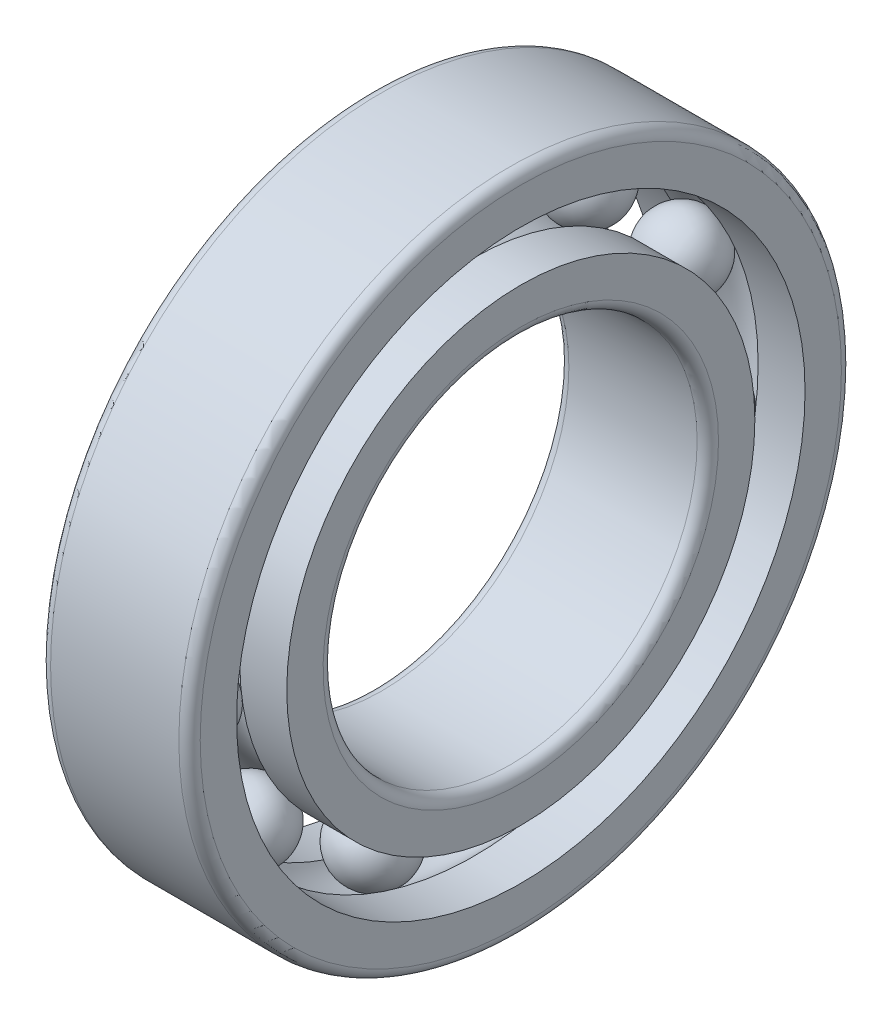
ISO-10303-21;
HEADER;
FILE_DESCRIPTION(('STEP AP214'),'2;1');
FILE_NAME('part.step','',(''),(''),'','','');
FILE_SCHEMA(('AUTOMOTIVE_DESIGN { 1 0 10303 214 1 1 1 1 }'));
ENDSEC;
DATA;
#1=APPLICATION_CONTEXT('core data for automotive mechanical design processes');
#2=APPLICATION_PROTOCOL_DEFINITION('international standard','automotive_design',2000,#1);
#3=PRODUCT_CONTEXT('',#1,'mechanical');
#4=PRODUCT('Part','Part','',(#3));
#5=PRODUCT_RELATED_PRODUCT_CATEGORY('part','',(#4));
#6=PRODUCT_DEFINITION_FORMATION('','',#4);
#7=PRODUCT_DEFINITION_CONTEXT('part definition',#1,'design');
#8=PRODUCT_DEFINITION('design','',#6,#7);
#9=PRODUCT_DEFINITION_SHAPE('','',#8);
#10=(LENGTH_UNIT() NAMED_UNIT(*) SI_UNIT(.MILLI.,.METRE.));
#11=(NAMED_UNIT(*) PLANE_ANGLE_UNIT() SI_UNIT($,.RADIAN.));
#12=(NAMED_UNIT(*) SI_UNIT($,.STERADIAN.) SOLID_ANGLE_UNIT());
#13=UNCERTAINTY_MEASURE_WITH_UNIT(LENGTH_MEASURE(1.E-05),#10,'distance_accuracy_value','');
#14=(GEOMETRIC_REPRESENTATION_CONTEXT(3) GLOBAL_UNCERTAINTY_ASSIGNED_CONTEXT((#13)) GLOBAL_UNIT_ASSIGNED_CONTEXT((#10,
#11,#12)) REPRESENTATION_CONTEXT('',''));
#15=CARTESIAN_POINT('',(0.,0.,0.));
#16=DIRECTION('',(0.,0.,1.));
#17=DIRECTION('',(1.,0.,0.));
#18=AXIS2_PLACEMENT_3D('',#15,#16,#17);
#19=CARTESIAN_POINT('',(7.,-15.8803727981732,18.3269271780908));
#20=DIRECTION('',(1.,0.,0.));
#21=DIRECTION('',(0.,-0.654860733945285,0.755749574354258));
#22=AXIS2_PLACEMENT_3D('',#19,#20,#21);
#23=SPHERICAL_SURFACE('',#22,3.51);
#24=CARTESIAN_POINT('',(3.49,-15.8803727981732,18.3269271780908));
#25=VERTEX_POINT('',#24);
#26=VERTEX_LOOP('',#25);
#27=FACE_BOUND('',#26,.T.);
#28=CARTESIAN_POINT('',(10.51,-15.8803727981732,18.3269271780908));
#29=VERTEX_POINT('',#28);
#30=VERTEX_LOOP('',#29);
#31=FACE_BOUND('',#30,.T.);
#32=ADVANCED_FACE('P0_F15',(#27,#31),#23,.T.);
#33=OPEN_SHELL('',(#32));
#34=SHELL_BASED_SURFACE_MODEL('P0_B1',(#33));
#35=CARTESIAN_POINT('',(7.,10.0738140652957,22.0585758873471));
#36=DIRECTION('',(1.,0.,0.));
#37=DIRECTION('',(0.,0.415415013001886,0.909631995354519));
#38=AXIS2_PLACEMENT_3D('',#35,#36,#37);
#39=SPHERICAL_SURFACE('',#38,3.51);
#40=CARTESIAN_POINT('',(3.49,10.0738140652957,22.0585758873471));
#41=VERTEX_POINT('',#40);
#42=VERTEX_LOOP('',#41);
#43=FACE_BOUND('',#42,.T.);
#44=CARTESIAN_POINT('',(10.51,10.0738140652957,22.0585758873471));
#45=VERTEX_POINT('',#44);
#46=VERTEX_LOOP('',#45);
#47=FACE_BOUND('',#46,.T.);
#48=ADVANCED_FACE('P1_F15',(#43,#47),#39,.T.);
#49=OPEN_SHELL('',(#48));
#50=SHELL_BASED_SURFACE_MODEL('P1_B1',(#49));
#51=CARTESIAN_POINT('',(7.,-23.2677046101516,-6.83201450340466));
#52=DIRECTION('',(1.,0.,0.));
#53=DIRECTION('',(0.,-0.959492973614498,-0.281732556841429));
#54=AXIS2_PLACEMENT_3D('',#51,#52,#53);
#55=SPHERICAL_SURFACE('',#54,3.51);
#56=CARTESIAN_POINT('',(3.49,-23.2677046101516,-6.83201450340466));
#57=VERTEX_POINT('',#56);
#58=VERTEX_LOOP('',#57);
#59=FACE_BOUND('',#58,.T.);
#60=CARTESIAN_POINT('',(10.51,-23.2677046101516,-6.83201450340466));
#61=VERTEX_POINT('',#60);
#62=VERTEX_LOOP('',#61);
#63=FACE_BOUND('',#62,.T.);
#64=ADVANCED_FACE('P2_F16',(#59,#63),#55,.T.);
#65=OPEN_SHELL('',(#64));
#66=SHELL_BASED_SURFACE_MODEL('P2_B1',(#65));
#67=CARTESIAN_POINT('',(7.,20.4003981711561,-13.1105398232982));
#68=DIRECTION('',(1.,0.,0.));
#69=DIRECTION('',(0.,0.841253532831181,-0.540640817455598));
#70=AXIS2_PLACEMENT_3D('',#67,#68,#69);
#71=SPHERICAL_SURFACE('',#70,3.51);
#72=CARTESIAN_POINT('',(3.49,20.4003981711561,-13.1105398232982));
#73=VERTEX_POINT('',#72);
#74=VERTEX_LOOP('',#73);
#75=FACE_BOUND('',#74,.T.);
#76=CARTESIAN_POINT('',(10.51,20.4003981711561,-13.1105398232982));
#77=VERTEX_POINT('',#76);
#78=VERTEX_LOOP('',#77);
#79=FACE_BOUND('',#78,.T.);
#80=ADVANCED_FACE('P3_F15',(#75,#79),#71,.T.);
#81=OPEN_SHELL('',(#80));
#82=SHELL_BASED_SURFACE_MODEL('P3_B1',(#81));
#83=CARTESIAN_POINT('',(7.,-3.45113482812716,-24.0031699656126));
#84=DIRECTION('',(1.,0.,0.));
#85=DIRECTION('',(0.,-0.142314838273285,-0.989821441880933));
#86=AXIS2_PLACEMENT_3D('',#83,#84,#85);
#87=SPHERICAL_SURFACE('',#86,3.51);
#88=CARTESIAN_POINT('',(3.49,-3.45113482812716,-24.0031699656126));
#89=VERTEX_POINT('',#88);
#90=VERTEX_LOOP('',#89);
#91=FACE_BOUND('',#90,.T.);
#92=CARTESIAN_POINT('',(10.51,-3.45113482812716,-24.0031699656126));
#93=VERTEX_POINT('',#92);
#94=VERTEX_LOOP('',#93);
#95=FACE_BOUND('',#94,.T.);
#96=ADVANCED_FACE('P4_F15',(#91,#95),#87,.T.);
#97=OPEN_SHELL('',(#96));
#98=SHELL_BASED_SURFACE_MODEL('P4_B1',(#97));
#99=CARTESIAN_POINT('',(7.,24.25,0.));
#100=DIRECTION('',(1.,0.,0.));
#101=DIRECTION('',(0.,1.,0.));
#102=AXIS2_PLACEMENT_3D('',#99,#100,#101);
#103=SPHERICAL_SURFACE('',#102,3.51);
#104=CARTESIAN_POINT('',(3.49,24.25,0.));
#105=VERTEX_POINT('',#104);
#106=VERTEX_LOOP('',#105);
#107=FACE_BOUND('',#106,.T.);
#108=CARTESIAN_POINT('',(10.51,24.25,0.));
#109=VERTEX_POINT('',#108);
#110=VERTEX_LOOP('',#109);
#111=FACE_BOUND('',#110,.T.);
#112=ADVANCED_FACE('P5_F15',(#107,#111),#103,.T.);
#113=OPEN_SHELL('',(#112));
#114=SHELL_BASED_SURFACE_MODEL('P5_B1',(#113));
#115=CARTESIAN_POINT('',(7.,20.4003981711561,13.1105398232982));
#116=DIRECTION('',(1.,0.,0.));
#117=DIRECTION('',(0.,0.841253532831181,0.540640817455598));
#118=AXIS2_PLACEMENT_3D('',#115,#116,#117);
#119=SPHERICAL_SURFACE('',#118,3.51);
#120=CARTESIAN_POINT('',(3.49,20.4003981711561,13.1105398232982));
#121=VERTEX_POINT('',#120);
#122=VERTEX_LOOP('',#121);
#123=FACE_BOUND('',#122,.T.);
#124=CARTESIAN_POINT('',(10.51,20.4003981711561,13.1105398232982));
#125=VERTEX_POINT('',#124);
#126=VERTEX_LOOP('',#125);
#127=FACE_BOUND('',#126,.T.);
#128=ADVANCED_FACE('P6_F15',(#123,#127),#119,.T.);
#129=OPEN_SHELL('',(#128));
#130=SHELL_BASED_SURFACE_MODEL('P6_B1',(#129));
#131=CARTESIAN_POINT('',(7.,-3.45113482812716,24.0031699656126));
#132=DIRECTION('',(1.,0.,0.));
#133=DIRECTION('',(0.,-0.142314838273285,0.989821441880933));
#134=AXIS2_PLACEMENT_3D('',#131,#132,#133);
#135=SPHERICAL_SURFACE('',#134,3.51);
#136=CARTESIAN_POINT('',(3.49,-3.45113482812716,24.0031699656126));
#137=VERTEX_POINT('',#136);
#138=VERTEX_LOOP('',#137);
#139=FACE_BOUND('',#138,.T.);
#140=CARTESIAN_POINT('',(10.51,-3.45113482812716,24.0031699656126));
#141=VERTEX_POINT('',#140);
#142=VERTEX_LOOP('',#141);
#143=FACE_BOUND('',#142,.T.);
#144=ADVANCED_FACE('P7_F15',(#139,#143),#135,.T.);
#145=OPEN_SHELL('',(#144));
#146=SHELL_BASED_SURFACE_MODEL('P7_B1',(#145));
#147=CARTESIAN_POINT('',(7.,10.0738140652957,-22.0585758873471));
#148=DIRECTION('',(1.,0.,0.));
#149=DIRECTION('',(0.,0.415415013001886,-0.909631995354519));
#150=AXIS2_PLACEMENT_3D('',#147,#148,#149);
#151=SPHERICAL_SURFACE('',#150,3.51);
#152=CARTESIAN_POINT('',(3.49,10.0738140652957,-22.0585758873471));
#153=VERTEX_POINT('',#152);
#154=VERTEX_LOOP('',#153);
#155=FACE_BOUND('',#154,.T.);
#156=CARTESIAN_POINT('',(10.51,10.0738140652957,-22.0585758873471));
#157=VERTEX_POINT('',#156);
#158=VERTEX_LOOP('',#157);
#159=FACE_BOUND('',#158,.T.);
#160=ADVANCED_FACE('P8_F15',(#155,#159),#151,.T.);
#161=OPEN_SHELL('',(#160));
#162=SHELL_BASED_SURFACE_MODEL('P8_B1',(#161));
#163=CARTESIAN_POINT('',(7.,-23.2677046101516,6.83201450340467));
#164=DIRECTION('',(1.,0.,0.));
#165=DIRECTION('',(0.,-0.959492973614497,0.28173255684143));
#166=AXIS2_PLACEMENT_3D('',#163,#164,#165);
#167=SPHERICAL_SURFACE('',#166,3.51);
#168=CARTESIAN_POINT('',(3.49,-23.2677046101516,6.83201450340467));
#169=VERTEX_POINT('',#168);
#170=VERTEX_LOOP('',#169);
#171=FACE_BOUND('',#170,.T.);
#172=CARTESIAN_POINT('',(10.51,-23.2677046101516,6.83201450340467));
#173=VERTEX_POINT('',#172);
#174=VERTEX_LOOP('',#173);
#175=FACE_BOUND('',#174,.T.);
#176=ADVANCED_FACE('P9_F15',(#171,#175),#167,.T.);
#177=OPEN_SHELL('',(#176));
#178=SHELL_BASED_SURFACE_MODEL('P9_B1',(#177));
#179=CARTESIAN_POINT('',(7.,-15.8803727981732,-18.3269271780908));
#180=DIRECTION('',(1.,0.,0.));
#181=DIRECTION('',(0.,-0.654860733945285,-0.755749574354258));
#182=AXIS2_PLACEMENT_3D('',#179,#180,#181);
#183=SPHERICAL_SURFACE('',#182,3.51);
#184=CARTESIAN_POINT('',(3.49,-15.8803727981732,-18.3269271780908));
#185=VERTEX_POINT('',#184);
#186=VERTEX_LOOP('',#185);
#187=FACE_BOUND('',#186,.T.);
#188=CARTESIAN_POINT('',(10.51,-15.8803727981732,-18.3269271780908));
#189=VERTEX_POINT('',#188);
#190=VERTEX_LOOP('',#189);
#191=FACE_BOUND('',#190,.T.);
#192=ADVANCED_FACE('P10_F15',(#187,#191),#183,.T.);
#193=OPEN_SHELL('',(#192));
#194=SHELL_BASED_SURFACE_MODEL('P10_B1',(#193));
#195=CARTESIAN_POINT('',(7.,0.,0.));
#196=DIRECTION('',(1.,0.,0.));
#197=DIRECTION('',(0.,0.,-1.));
#198=AXIS2_PLACEMENT_3D('',#195,#196,#197);
#199=TOROIDAL_SURFACE('',#198,24.25,3.51);
#200=CARTESIAN_POINT('',(9.60812173795626,0.,0.));
#201=DIRECTION('',(1.,0.,0.));
#202=DIRECTION('',(0.,0.,-1.));
#203=AXIS2_PLACEMENT_3D('',#200,#201,#202);
#204=CIRCLE('',#203,21.901);
#205=CARTESIAN_POINT('',(9.60812173795626,0.,-21.901));
#206=VERTEX_POINT('',#205);
#207=EDGE_CURVE('P11_E112',#206,#206,#204,.T.);
#208=ORIENTED_EDGE('',*,*,#207,.F.);
#209=EDGE_LOOP('',(#208));
#210=FACE_BOUND('',#209,.T.);
#211=CARTESIAN_POINT('',(4.39187826204374,0.,0.));
#212=DIRECTION('',(1.,0.,0.));
#213=DIRECTION('',(0.,0.,-1.));
#214=AXIS2_PLACEMENT_3D('',#211,#212,#213);
#215=CIRCLE('',#214,21.901);
#216=CARTESIAN_POINT('',(4.39187826204374,0.,-21.901));
#217=VERTEX_POINT('',#216);
#218=EDGE_CURVE('P11_E115',#217,#217,#215,.F.);
#219=ORIENTED_EDGE('',*,*,#218,.F.);
#220=EDGE_LOOP('',(#219));
#221=FACE_BOUND('',#220,.T.);
#222=ADVANCED_FACE('P11_F14',(#210,#221),#199,.F.);
#223=CARTESIAN_POINT('',(2.19593913102187,0.,0.));
#224=DIRECTION('',(1.,0.,0.));
#225=DIRECTION('',(0.,0.,-1.));
#226=AXIS2_PLACEMENT_3D('',#223,#224,#225);
#227=CYLINDRICAL_SURFACE('',#226,21.901);
#228=CARTESIAN_POINT('',(0.,0.,0.));
#229=DIRECTION('',(1.,0.,0.));
#230=DIRECTION('',(0.,0.,-1.));
#231=AXIS2_PLACEMENT_3D('',#228,#229,#230);
#232=CIRCLE('',#231,21.901);
#233=CARTESIAN_POINT('',(0.,0.,-21.901));
#234=VERTEX_POINT('',#233);
#235=EDGE_CURVE('P11_E18',#234,#234,#232,.F.);
#236=ORIENTED_EDGE('',*,*,#235,.F.);
#237=EDGE_LOOP('',(#236));
#238=FACE_BOUND('',#237,.T.);
#239=ORIENTED_EDGE('',*,*,#218,.T.);
#240=EDGE_LOOP('',(#239));
#241=FACE_BOUND('',#240,.T.);
#242=ADVANCED_FACE('P11_F83',(#238,#241),#227,.T.);
#243=CARTESIAN_POINT('',(11.8040608689781,0.,0.));
#244=DIRECTION('',(1.,0.,0.));
#245=DIRECTION('',(0.,0.,-1.));
#246=AXIS2_PLACEMENT_3D('',#243,#244,#245);
#247=CYLINDRICAL_SURFACE('',#246,21.901);
#248=ORIENTED_EDGE('',*,*,#207,.T.);
#249=EDGE_LOOP('',(#248));
#250=FACE_BOUND('',#249,.T.);
#251=CARTESIAN_POINT('',(14.,0.,0.));
#252=DIRECTION('',(1.,0.,0.));
#253=DIRECTION('',(0.,0.,-1.));
#254=AXIS2_PLACEMENT_3D('',#251,#252,#253);
#255=CIRCLE('',#254,21.901);
#256=CARTESIAN_POINT('',(14.,0.,-21.901));
#257=VERTEX_POINT('',#256);
#258=EDGE_CURVE('P11_E107',#257,#257,#255,.T.);
#259=ORIENTED_EDGE('',*,*,#258,.F.);
#260=EDGE_LOOP('',(#259));
#261=FACE_BOUND('',#260,.T.);
#262=ADVANCED_FACE('P11_F80',(#250,#261),#247,.T.);
#263=CARTESIAN_POINT('',(0.,19.7005,0.));
#264=DIRECTION('',(-1.,0.,0.));
#265=DIRECTION('',(0.,0.,1.));
#266=AXIS2_PLACEMENT_3D('',#263,#264,#265);
#267=PLANE('',#266);
#268=CARTESIAN_POINT('',(0.,0.,0.));
#269=DIRECTION('',(-1.,0.,0.));
#270=DIRECTION('',(0.,1.,0.));
#271=AXIS2_PLACEMENT_3D('',#268,#269,#270);
#272=CIRCLE('',#271,18.5);
#273=CARTESIAN_POINT('',(0.,18.5,0.));
#274=VERTEX_POINT('',#273);
#275=EDGE_CURVE('P11_E64',#274,#274,#272,.T.);
#276=ORIENTED_EDGE('',*,*,#275,.F.);
#277=EDGE_LOOP('',(#276));
#278=FACE_BOUND('',#277,.T.);
#279=ORIENTED_EDGE('',*,*,#235,.T.);
#280=EDGE_LOOP('',(#279));
#281=FACE_BOUND('',#280,.T.);
#282=ADVANCED_FACE('P11_F70',(#278,#281),#267,.T.);
#283=CARTESIAN_POINT('',(14.,19.7005,0.));
#284=DIRECTION('',(1.,0.,0.));
#285=DIRECTION('',(0.,0.,-1.));
#286=AXIS2_PLACEMENT_3D('',#283,#284,#285);
#287=PLANE('',#286);
#288=CARTESIAN_POINT('',(14.,0.,0.));
#289=DIRECTION('',(1.,0.,0.));
#290=DIRECTION('',(0.,1.,0.));
#291=AXIS2_PLACEMENT_3D('',#288,#289,#290);
#292=CIRCLE('',#291,18.5);
#293=CARTESIAN_POINT('',(14.,18.5,0.));
#294=VERTEX_POINT('',#293);
#295=EDGE_CURVE('P11_E27',#294,#294,#292,.T.);
#296=ORIENTED_EDGE('',*,*,#295,.F.);
#297=EDGE_LOOP('',(#296));
#298=FACE_BOUND('',#297,.T.);
#299=ORIENTED_EDGE('',*,*,#258,.T.);
#300=EDGE_LOOP('',(#299));
#301=FACE_BOUND('',#300,.T.);
#302=ADVANCED_FACE('P11_F79',(#298,#301),#287,.T.);
#303=CARTESIAN_POINT('',(0.999999999999996,0.,0.));
#304=DIRECTION('',(1.,0.,0.));
#305=DIRECTION('',(0.,0.,-1.));
#306=AXIS2_PLACEMENT_3D('',#303,#304,#305);
#307=TOROIDAL_SURFACE('',#306,18.5,1.);
#308=ORIENTED_EDGE('',*,*,#275,.T.);
#309=EDGE_LOOP('',(#308));
#310=FACE_BOUND('',#309,.T.);
#311=CARTESIAN_POINT('',(0.999999999999997,0.,0.));
#312=DIRECTION('',(1.,0.,0.));
#313=DIRECTION('',(0.,0.,-1.));
#314=AXIS2_PLACEMENT_3D('',#311,#312,#313);
#315=CIRCLE('',#314,17.5);
#316=CARTESIAN_POINT('',(0.999999999999997,0.,-17.5));
#317=VERTEX_POINT('',#316);
#318=EDGE_CURVE('P11_E22',#317,#317,#315,.T.);
#319=ORIENTED_EDGE('',*,*,#318,.T.);
#320=EDGE_LOOP('',(#319));
#321=FACE_BOUND('',#320,.T.);
#322=ADVANCED_FACE('P11_F45',(#310,#321),#307,.T.);
#323=CARTESIAN_POINT('',(13.,0.,0.));
#324=DIRECTION('',(1.,0.,0.));
#325=DIRECTION('',(0.,0.,-1.));
#326=AXIS2_PLACEMENT_3D('',#323,#324,#325);
#327=TOROIDAL_SURFACE('',#326,18.5,1.);
#328=CARTESIAN_POINT('',(13.,0.,0.));
#329=DIRECTION('',(1.,0.,0.));
#330=DIRECTION('',(0.,0.,-1.));
#331=AXIS2_PLACEMENT_3D('',#328,#329,#330);
#332=CIRCLE('',#331,17.5);
#333=CARTESIAN_POINT('',(13.,0.,-17.5));
#334=VERTEX_POINT('',#333);
#335=EDGE_CURVE('P11_E10',#334,#334,#332,.F.);
#336=ORIENTED_EDGE('',*,*,#335,.T.);
#337=EDGE_LOOP('',(#336));
#338=FACE_BOUND('',#337,.T.);
#339=ORIENTED_EDGE('',*,*,#295,.T.);
#340=EDGE_LOOP('',(#339));
#341=FACE_BOUND('',#340,.T.);
#342=ADVANCED_FACE('P11_F39',(#338,#341),#327,.T.);
#343=CARTESIAN_POINT('',(7.,0.,0.));
#344=DIRECTION('',(1.,0.,0.));
#345=DIRECTION('',(0.,0.,-1.));
#346=AXIS2_PLACEMENT_3D('',#343,#344,#345);
#347=CYLINDRICAL_SURFACE('',#346,17.5);
#348=ORIENTED_EDGE('',*,*,#335,.F.);
#349=EDGE_LOOP('',(#348));
#350=FACE_BOUND('',#349,.T.);
#351=ORIENTED_EDGE('',*,*,#318,.F.);
#352=EDGE_LOOP('',(#351));
#353=FACE_BOUND('',#352,.T.);
#354=ADVANCED_FACE('P11_F44',(#350,#353),#347,.F.);
#355=CLOSED_SHELL('',(#222,#242,#262,#282,#302,#322,#342,#354));
#356=MANIFOLD_SOLID_BREP('P11_B1',#355);
#357=CARTESIAN_POINT('',(7.,0.,0.));
#358=DIRECTION('',(1.,0.,0.));
#359=DIRECTION('',(0.,0.,-1.));
#360=AXIS2_PLACEMENT_3D('',#357,#358,#359);
#361=TOROIDAL_SURFACE('',#360,24.25,3.51);
#362=CARTESIAN_POINT('',(4.39187826204374,0.,0.));
#363=DIRECTION('',(1.,0.,0.));
#364=DIRECTION('',(0.,0.,-1.));
#365=AXIS2_PLACEMENT_3D('',#362,#363,#364);
#366=CIRCLE('',#365,26.599);
#367=CARTESIAN_POINT('',(4.39187826204374,0.,-26.599));
#368=VERTEX_POINT('',#367);
#369=EDGE_CURVE('P12_E112',#368,#368,#366,.F.);
#370=ORIENTED_EDGE('',*,*,#369,.T.);
#371=EDGE_LOOP('',(#370));
#372=FACE_BOUND('',#371,.T.);
#373=CARTESIAN_POINT('',(9.60812173795626,0.,0.));
#374=DIRECTION('',(1.,0.,0.));
#375=DIRECTION('',(0.,0.,-1.));
#376=AXIS2_PLACEMENT_3D('',#373,#374,#375);
#377=CIRCLE('',#376,26.599);
#378=CARTESIAN_POINT('',(9.60812173795626,0.,-26.599));
#379=VERTEX_POINT('',#378);
#380=EDGE_CURVE('P12_E109',#379,#379,#377,.T.);
#381=ORIENTED_EDGE('',*,*,#380,.T.);
#382=EDGE_LOOP('',(#381));
#383=FACE_BOUND('',#382,.T.);
#384=ADVANCED_FACE('P12_F14',(#372,#383),#361,.F.);
#385=CARTESIAN_POINT('',(2.19593913102186,0.,0.));
#386=DIRECTION('',(1.,0.,0.));
#387=DIRECTION('',(0.,0.,-1.));
#388=AXIS2_PLACEMENT_3D('',#385,#386,#387);
#389=CYLINDRICAL_SURFACE('',#388,26.599);
#390=ORIENTED_EDGE('',*,*,#369,.F.);
#391=EDGE_LOOP('',(#390));
#392=FACE_BOUND('',#391,.T.);
#393=CARTESIAN_POINT('',(0.,0.,0.));
#394=DIRECTION('',(1.,0.,0.));
#395=DIRECTION('',(0.,0.,-1.));
#396=AXIS2_PLACEMENT_3D('',#393,#394,#395);
#397=CIRCLE('',#396,26.599);
#398=CARTESIAN_POINT('',(0.,0.,-26.599));
#399=VERTEX_POINT('',#398);
#400=EDGE_CURVE('P12_E18',#399,#399,#397,.T.);
#401=ORIENTED_EDGE('',*,*,#400,.F.);
#402=EDGE_LOOP('',(#401));
#403=FACE_BOUND('',#402,.T.);
#404=ADVANCED_FACE('P12_F85',(#392,#403),#389,.F.);
#405=CARTESIAN_POINT('',(11.8040608689781,0.,0.));
#406=DIRECTION('',(1.,0.,0.));
#407=DIRECTION('',(0.,0.,-1.));
#408=AXIS2_PLACEMENT_3D('',#405,#406,#407);
#409=CYLINDRICAL_SURFACE('',#408,26.599);
#410=CARTESIAN_POINT('',(14.,0.,0.));
#411=DIRECTION('',(1.,0.,0.));
#412=DIRECTION('',(0.,0.,-1.));
#413=AXIS2_PLACEMENT_3D('',#410,#411,#412);
#414=CIRCLE('',#413,26.599);
#415=CARTESIAN_POINT('',(14.,0.,-26.599));
#416=VERTEX_POINT('',#415);
#417=EDGE_CURVE('P12_E104',#416,#416,#414,.F.);
#418=ORIENTED_EDGE('',*,*,#417,.F.);
#419=EDGE_LOOP('',(#418));
#420=FACE_BOUND('',#419,.T.);
#421=ORIENTED_EDGE('',*,*,#380,.F.);
#422=EDGE_LOOP('',(#421));
#423=FACE_BOUND('',#422,.T.);
#424=ADVANCED_FACE('P12_F81',(#420,#423),#409,.F.);
#425=CARTESIAN_POINT('',(0.,28.7995,0.));
#426=DIRECTION('',(-1.,0.,0.));
#427=DIRECTION('',(0.,0.,1.));
#428=AXIS2_PLACEMENT_3D('',#425,#426,#427);
#429=PLANE('',#428);
#430=ORIENTED_EDGE('',*,*,#400,.T.);
#431=EDGE_LOOP('',(#430));
#432=FACE_BOUND('',#431,.T.);
#433=CARTESIAN_POINT('',(0.,0.,0.));
#434=DIRECTION('',(1.,0.,0.));
#435=DIRECTION('',(0.,1.,0.));
#436=AXIS2_PLACEMENT_3D('',#433,#434,#435);
#437=CIRCLE('',#436,30.);
#438=CARTESIAN_POINT('',(0.,30.,0.));
#439=VERTEX_POINT('',#438);
#440=EDGE_CURVE('P12_E65',#439,#439,#437,.T.);
#441=ORIENTED_EDGE('',*,*,#440,.F.);
#442=EDGE_LOOP('',(#441));
#443=FACE_BOUND('',#442,.T.);
#444=ADVANCED_FACE('P12_F71',(#432,#443),#429,.T.);
#445=CARTESIAN_POINT('',(14.,28.7995,0.));
#446=DIRECTION('',(1.,0.,0.));
#447=DIRECTION('',(0.,0.,-1.));
#448=AXIS2_PLACEMENT_3D('',#445,#446,#447);
#449=PLANE('',#448);
#450=ORIENTED_EDGE('',*,*,#417,.T.);
#451=EDGE_LOOP('',(#450));
#452=FACE_BOUND('',#451,.T.);
#453=CARTESIAN_POINT('',(14.,0.,0.));
#454=DIRECTION('',(-1.,0.,0.));
#455=DIRECTION('',(0.,1.,0.));
#456=AXIS2_PLACEMENT_3D('',#453,#454,#455);
#457=CIRCLE('',#456,30.);
#458=CARTESIAN_POINT('',(14.,30.,0.));
#459=VERTEX_POINT('',#458);
#460=EDGE_CURVE('P12_E27',#459,#459,#457,.T.);
#461=ORIENTED_EDGE('',*,*,#460,.F.);
#462=EDGE_LOOP('',(#461));
#463=FACE_BOUND('',#462,.T.);
#464=ADVANCED_FACE('P12_F80',(#452,#463),#449,.T.);
#465=CARTESIAN_POINT('',(0.99999999999999,0.,0.));
#466=DIRECTION('',(1.,0.,0.));
#467=DIRECTION('',(0.,0.,-1.));
#468=AXIS2_PLACEMENT_3D('',#465,#466,#467);
#469=TOROIDAL_SURFACE('',#468,30.,1.);
#470=CARTESIAN_POINT('',(0.99999999999999,0.,0.));
#471=DIRECTION('',(1.,0.,0.));
#472=DIRECTION('',(0.,0.,-1.));
#473=AXIS2_PLACEMENT_3D('',#470,#471,#472);
#474=CIRCLE('',#473,31.);
#475=CARTESIAN_POINT('',(0.99999999999999,0.,-31.));
#476=VERTEX_POINT('',#475);
#477=EDGE_CURVE('P12_E22',#476,#476,#474,.T.);
#478=ORIENTED_EDGE('',*,*,#477,.F.);
#479=EDGE_LOOP('',(#478));
#480=FACE_BOUND('',#479,.T.);
#481=ORIENTED_EDGE('',*,*,#440,.T.);
#482=EDGE_LOOP('',(#481));
#483=FACE_BOUND('',#482,.T.);
#484=ADVANCED_FACE('P12_F45',(#480,#483),#469,.T.);
#485=CARTESIAN_POINT('',(13.,0.,0.));
#486=DIRECTION('',(1.,0.,0.));
#487=DIRECTION('',(0.,0.,-1.));
#488=AXIS2_PLACEMENT_3D('',#485,#486,#487);
#489=TOROIDAL_SURFACE('',#488,30.,1.);
#490=ORIENTED_EDGE('',*,*,#460,.T.);
#491=EDGE_LOOP('',(#490));
#492=FACE_BOUND('',#491,.T.);
#493=CARTESIAN_POINT('',(13.,0.,0.));
#494=DIRECTION('',(1.,0.,0.));
#495=DIRECTION('',(0.,0.,-1.));
#496=AXIS2_PLACEMENT_3D('',#493,#494,#495);
#497=CIRCLE('',#496,31.);
#498=CARTESIAN_POINT('',(13.,0.,-31.));
#499=VERTEX_POINT('',#498);
#500=EDGE_CURVE('P12_E10',#499,#499,#497,.F.);
#501=ORIENTED_EDGE('',*,*,#500,.F.);
#502=EDGE_LOOP('',(#501));
#503=FACE_BOUND('',#502,.T.);
#504=ADVANCED_FACE('P12_F39',(#492,#503),#489,.T.);
#505=CARTESIAN_POINT('',(7.,0.,0.));
#506=DIRECTION('',(1.,0.,0.));
#507=DIRECTION('',(0.,0.,-1.));
#508=AXIS2_PLACEMENT_3D('',#505,#506,#507);
#509=CYLINDRICAL_SURFACE('',#508,31.);
#510=ORIENTED_EDGE('',*,*,#500,.T.);
#511=EDGE_LOOP('',(#510));
#512=FACE_BOUND('',#511,.T.);
#513=ORIENTED_EDGE('',*,*,#477,.T.);
#514=EDGE_LOOP('',(#513));
#515=FACE_BOUND('',#514,.T.);
#516=ADVANCED_FACE('P12_F44',(#512,#515),#509,.T.);
#517=CLOSED_SHELL('',(#384,#404,#424,#444,#464,#484,#504,#516));
#518=MANIFOLD_SOLID_BREP('P12_B1',#517);
#519=ADVANCED_BREP_SHAPE_REPRESENTATION('',(#18,#356,#518),#14);
#520=MANIFOLD_SURFACE_SHAPE_REPRESENTATION('',(#18,#34,#50,#66,#82,#98,#114,#130,#146,#162,#178,
#194),#14);
#521=SHAPE_REPRESENTATION('',(#18),#14);
#522=SHAPE_DEFINITION_REPRESENTATION(#9,#521);
#523=SHAPE_REPRESENTATION_RELATIONSHIP('','',#521,#519);
#524=SHAPE_REPRESENTATION_RELATIONSHIP('','',#521,#520);
ENDSEC;
END-ISO-10303-21;
